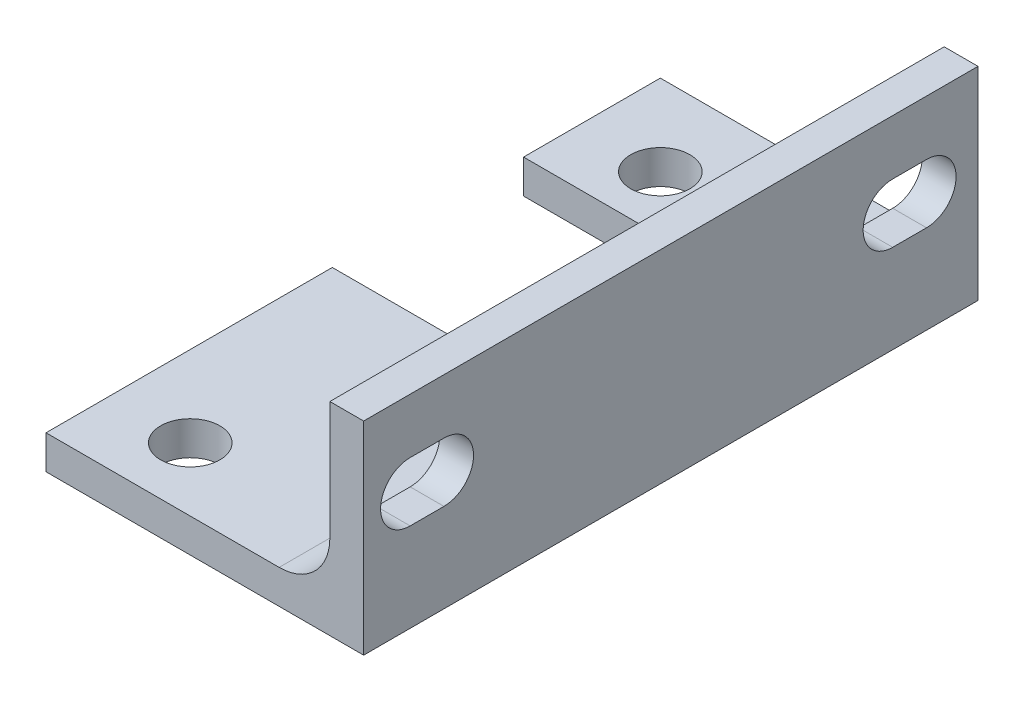
ISO-10303-21;
HEADER;
FILE_DESCRIPTION(('STEP AP214'),'2;1');
FILE_NAME('part.step','',(''),(''),'','','');
FILE_SCHEMA(('AUTOMOTIVE_DESIGN { 1 0 10303 214 1 1 1 1 }'));
ENDSEC;
DATA;
#1=APPLICATION_CONTEXT('core data for automotive mechanical design processes');
#2=APPLICATION_PROTOCOL_DEFINITION('international standard','automotive_design',2000,#1);
#3=PRODUCT_CONTEXT('',#1,'mechanical');
#4=PRODUCT('Part','Part','',(#3));
#5=PRODUCT_RELATED_PRODUCT_CATEGORY('part','',(#4));
#6=PRODUCT_DEFINITION_FORMATION('','',#4);
#7=PRODUCT_DEFINITION_CONTEXT('part definition',#1,'design');
#8=PRODUCT_DEFINITION('design','',#6,#7);
#9=PRODUCT_DEFINITION_SHAPE('','',#8);
#10=(LENGTH_UNIT() NAMED_UNIT(*) SI_UNIT(.MILLI.,.METRE.));
#11=(NAMED_UNIT(*) PLANE_ANGLE_UNIT() SI_UNIT($,.RADIAN.));
#12=(NAMED_UNIT(*) SI_UNIT($,.STERADIAN.) SOLID_ANGLE_UNIT());
#13=UNCERTAINTY_MEASURE_WITH_UNIT(LENGTH_MEASURE(1.E-05),#10,'distance_accuracy_value','');
#14=(GEOMETRIC_REPRESENTATION_CONTEXT(3) GLOBAL_UNCERTAINTY_ASSIGNED_CONTEXT((#13)) GLOBAL_UNIT_ASSIGNED_CONTEXT((#10,
#11,#12)) REPRESENTATION_CONTEXT('',''));
#15=CARTESIAN_POINT('',(0.,0.,0.));
#16=DIRECTION('',(0.,0.,1.));
#17=DIRECTION('',(1.,0.,0.));
#18=AXIS2_PLACEMENT_3D('',#15,#16,#17);
#19=CARTESIAN_POINT('',(0.,2.,0.));
#20=DIRECTION('',(0.,1.,0.));
#21=DIRECTION('',(0.,0.,1.));
#22=AXIS2_PLACEMENT_3D('',#19,#20,#21);
#23=PLANE('',#22);
#24=DIRECTION('',(1.,0.,0.));
#25=VECTOR('',#24,1.);
#26=CARTESIAN_POINT('',(5.60300623426312,2.,-2.5192554370748));
#27=LINE('',#26,#25);
#28=CARTESIAN_POINT('',(-1.92927117390983,2.,-2.5192554370748));
#29=VERTEX_POINT('',#28);
#30=CARTESIAN_POINT('',(11.8665295460925,2.,-2.5192554370748));
#31=VERTEX_POINT('',#30);
#32=EDGE_CURVE('E279',#29,#31,#27,.T.);
#33=ORIENTED_EDGE('',*,*,#32,.T.);
#34=DIRECTION('',(0.,0.,1.));
#35=VECTOR('',#34,1.);
#36=CARTESIAN_POINT('',(11.8665295460925,2.,0.));
#37=LINE('',#36,#35);
#38=CARTESIAN_POINT('',(11.8665295460925,2.,-38.869849506745));
#39=VERTEX_POINT('',#38);
#40=EDGE_CURVE('E53',#31,#39,#37,.F.);
#41=ORIENTED_EDGE('',*,*,#40,.T.);
#42=DIRECTION('',(-1.,0.,0.));
#43=VECTOR('',#42,1.);
#44=CARTESIAN_POINT('',(4.37040298014703,2.,-38.869849506745));
#45=LINE('',#44,#43);
#46=CARTESIAN_POINT('',(-1.92927117390983,2.,-38.869849506745));
#47=VERTEX_POINT('',#46);
#48=EDGE_CURVE('E266',#39,#47,#45,.T.);
#49=ORIENTED_EDGE('',*,*,#48,.T.);
#50=DIRECTION('',(0.,0.,1.));
#51=VECTOR('',#50,1.);
#52=CARTESIAN_POINT('',(-1.92927117390983,2.,-38.869849506745));
#53=LINE('',#52,#51);
#54=CARTESIAN_POINT('',(-1.92927117390983,2.,-30.7757565881923));
#55=VERTEX_POINT('',#54);
#56=EDGE_CURVE('E268',#47,#55,#53,.T.);
#57=ORIENTED_EDGE('',*,*,#56,.T.);
#58=DIRECTION('',(1.,0.,0.));
#59=VECTOR('',#58,1.);
#60=CARTESIAN_POINT('',(-1.92927117390983,2.,-30.7757565881923));
#61=LINE('',#60,#59);
#62=CARTESIAN_POINT('',(6.86652954609252,2.,-30.7757565881923));
#63=VERTEX_POINT('',#62);
#64=EDGE_CURVE('E271',#55,#63,#61,.T.);
#65=ORIENTED_EDGE('',*,*,#64,.T.);
#66=DIRECTION('',(0.,0.,1.));
#67=VECTOR('',#66,1.);
#68=CARTESIAN_POINT('',(6.86652954609252,2.,-30.7757565881923));
#69=LINE('',#68,#67);
#70=CARTESIAN_POINT('',(6.86652954609252,2.,-19.4605566961608));
#71=VERTEX_POINT('',#70);
#72=EDGE_CURVE('E273',#63,#71,#69,.T.);
#73=ORIENTED_EDGE('',*,*,#72,.T.);
#74=DIRECTION('',(-1.,0.,0.));
#75=VECTOR('',#74,1.);
#76=CARTESIAN_POINT('',(-1.92927117390983,2.,-19.4605566961608));
#77=LINE('',#76,#75);
#78=CARTESIAN_POINT('',(-1.92927117390983,2.,-19.4605566961608));
#79=VERTEX_POINT('',#78);
#80=EDGE_CURVE('E275',#71,#79,#77,.T.);
#81=ORIENTED_EDGE('',*,*,#80,.T.);
#82=DIRECTION('',(0.,0.,1.));
#83=VECTOR('',#82,1.);
#84=CARTESIAN_POINT('',(-1.92927117390983,2.,-2.5192554370748));
#85=LINE('',#84,#83);
#86=EDGE_CURVE('E277',#79,#29,#85,.T.);
#87=ORIENTED_EDGE('',*,*,#86,.T.);
#88=EDGE_LOOP('',(#33,#41,#49,#57,#65,#73,#81,#87));
#89=FACE_BOUND('',#88,.T.);
#90=CARTESIAN_POINT('',(2.86810593891513,2.,-34.0705679355194));
#91=DIRECTION('',(0.,1.,0.));
#92=DIRECTION('',(0.,0.,1.));
#93=AXIS2_PLACEMENT_3D('',#90,#91,#92);
#94=CIRCLE('',#93,1.75);
#95=CARTESIAN_POINT('',(2.86810593891513,2.,-32.3205679355194));
#96=VERTEX_POINT('',#95);
#97=EDGE_CURVE('E260',#96,#96,#94,.T.);
#98=ORIENTED_EDGE('',*,*,#97,.F.);
#99=EDGE_LOOP('',(#98));
#100=FACE_BOUND('',#99,.T.);
#101=CARTESIAN_POINT('',(2.85480124686773,2.,-6.27057111923954));
#102=DIRECTION('',(0.,1.,0.));
#103=DIRECTION('',(0.,0.,1.));
#104=AXIS2_PLACEMENT_3D('',#101,#102,#103);
#105=CIRCLE('',#104,1.75);
#106=CARTESIAN_POINT('',(2.85480124686773,2.,-4.52057111923954));
#107=VERTEX_POINT('',#106);
#108=EDGE_CURVE('E254',#107,#107,#105,.T.);
#109=ORIENTED_EDGE('',*,*,#108,.F.);
#110=EDGE_LOOP('',(#109));
#111=FACE_BOUND('',#110,.T.);
#112=ADVANCED_FACE('F32',(#89,#100,#111),#23,.T.);
#113=CARTESIAN_POINT('',(0.,0.,0.));
#114=DIRECTION('',(0.,1.,0.));
#115=DIRECTION('',(0.,0.,1.));
#116=AXIS2_PLACEMENT_3D('',#113,#114,#115);
#117=PLANE('',#116);
#118=DIRECTION('',(0.,0.,1.));
#119=VECTOR('',#118,1.);
#120=CARTESIAN_POINT('',(-1.92927117390983,0.,-38.869849506745));
#121=LINE('',#120,#119);
#122=CARTESIAN_POINT('',(-1.92927117390983,0.,-38.869849506745));
#123=VERTEX_POINT('',#122);
#124=CARTESIAN_POINT('',(-1.92927117390983,0.,-30.7757565881923));
#125=VERTEX_POINT('',#124);
#126=EDGE_CURVE('E263',#123,#125,#121,.T.);
#127=ORIENTED_EDGE('',*,*,#126,.F.);
#128=DIRECTION('',(-1.,0.,0.));
#129=VECTOR('',#128,1.);
#130=CARTESIAN_POINT('',(4.37040298014703,0.,-38.869849506745));
#131=LINE('',#130,#129);
#132=CARTESIAN_POINT('',(16.8665295460925,0.,-38.869849506745));
#133=VERTEX_POINT('',#132);
#134=EDGE_CURVE('E269',#133,#123,#131,.T.);
#135=ORIENTED_EDGE('',*,*,#134,.F.);
#136=DIRECTION('',(0.,0.,-1.));
#137=VECTOR('',#136,1.);
#138=CARTESIAN_POINT('',(16.8665295460925,0.,-38.869849506745));
#139=LINE('',#138,#137);
#140=CARTESIAN_POINT('',(16.8665295460925,0.,-2.5192554370748));
#141=VERTEX_POINT('',#140);
#142=EDGE_CURVE('E294',#141,#133,#139,.T.);
#143=ORIENTED_EDGE('',*,*,#142,.F.);
#144=DIRECTION('',(1.,0.,0.));
#145=VECTOR('',#144,1.);
#146=CARTESIAN_POINT('',(5.60300623426312,0.,-2.5192554370748));
#147=LINE('',#146,#145);
#148=CARTESIAN_POINT('',(-1.92927117390983,0.,-2.5192554370748));
#149=VERTEX_POINT('',#148);
#150=EDGE_CURVE('E292',#149,#141,#147,.T.);
#151=ORIENTED_EDGE('',*,*,#150,.F.);
#152=DIRECTION('',(0.,0.,1.));
#153=VECTOR('',#152,1.);
#154=CARTESIAN_POINT('',(-1.92927117390983,0.,-2.5192554370748));
#155=LINE('',#154,#153);
#156=CARTESIAN_POINT('',(-1.92927117390983,0.,-19.4605566961608));
#157=VERTEX_POINT('',#156);
#158=EDGE_CURVE('E289',#157,#149,#155,.T.);
#159=ORIENTED_EDGE('',*,*,#158,.F.);
#160=DIRECTION('',(-1.,0.,0.));
#161=VECTOR('',#160,1.);
#162=CARTESIAN_POINT('',(-1.92927117390983,0.,-19.4605566961608));
#163=LINE('',#162,#161);
#164=CARTESIAN_POINT('',(6.86652954609252,0.,-19.4605566961608));
#165=VERTEX_POINT('',#164);
#166=EDGE_CURVE('E287',#165,#157,#163,.T.);
#167=ORIENTED_EDGE('',*,*,#166,.F.);
#168=DIRECTION('',(0.,0.,1.));
#169=VECTOR('',#168,1.);
#170=CARTESIAN_POINT('',(6.86652954609252,0.,-30.7757565881923));
#171=LINE('',#170,#169);
#172=CARTESIAN_POINT('',(6.86652954609252,0.,-30.7757565881923));
#173=VERTEX_POINT('',#172);
#174=EDGE_CURVE('E285',#173,#165,#171,.T.);
#175=ORIENTED_EDGE('',*,*,#174,.F.);
#176=DIRECTION('',(1.,0.,0.));
#177=VECTOR('',#176,1.);
#178=CARTESIAN_POINT('',(-1.92927117390983,0.,-30.7757565881923));
#179=LINE('',#178,#177);
#180=EDGE_CURVE('E283',#125,#173,#179,.T.);
#181=ORIENTED_EDGE('',*,*,#180,.F.);
#182=EDGE_LOOP('',(#127,#135,#143,#151,#159,#167,#175,#181));
#183=FACE_BOUND('',#182,.T.);
#184=CARTESIAN_POINT('',(2.86810593891513,0.,-34.0705679355194));
#185=DIRECTION('',(0.,1.,0.));
#186=DIRECTION('',(0.,0.,1.));
#187=AXIS2_PLACEMENT_3D('',#184,#185,#186);
#188=CIRCLE('',#187,1.75);
#189=CARTESIAN_POINT('',(2.86810593891513,0.,-32.3205679355194));
#190=VERTEX_POINT('',#189);
#191=EDGE_CURVE('E257',#190,#190,#188,.T.);
#192=ORIENTED_EDGE('',*,*,#191,.T.);
#193=EDGE_LOOP('',(#192));
#194=FACE_BOUND('',#193,.T.);
#195=CARTESIAN_POINT('',(2.85480124686773,0.,-6.27057111923954));
#196=DIRECTION('',(0.,1.,0.));
#197=DIRECTION('',(0.,0.,1.));
#198=AXIS2_PLACEMENT_3D('',#195,#196,#197);
#199=CIRCLE('',#198,1.75);
#200=CARTESIAN_POINT('',(2.85480124686773,0.,-4.52057111923954));
#201=VERTEX_POINT('',#200);
#202=EDGE_CURVE('E253',#201,#201,#199,.T.);
#203=ORIENTED_EDGE('',*,*,#202,.T.);
#204=EDGE_LOOP('',(#203));
#205=FACE_BOUND('',#204,.T.);
#206=ADVANCED_FACE('F349',(#183,#194,#205),#117,.F.);
#207=CARTESIAN_POINT('',(-1.92927117390983,2.,-38.869849506745));
#208=DIRECTION('',(1.,0.,0.));
#209=DIRECTION('',(0.,0.,-1.));
#210=AXIS2_PLACEMENT_3D('',#207,#208,#209);
#211=PLANE('',#210);
#212=ORIENTED_EDGE('',*,*,#126,.T.);
#213=DIRECTION('',(0.,-1.,0.));
#214=VECTOR('',#213,1.);
#215=CARTESIAN_POINT('',(-1.92927117390983,2.,-30.7757565881923));
#216=LINE('',#215,#214);
#217=EDGE_CURVE('E314',#55,#125,#216,.T.);
#218=ORIENTED_EDGE('',*,*,#217,.F.);
#219=ORIENTED_EDGE('',*,*,#56,.F.);
#220=DIRECTION('',(0.,-1.,0.));
#221=VECTOR('',#220,1.);
#222=CARTESIAN_POINT('',(-1.92927117390983,2.,-38.869849506745));
#223=LINE('',#222,#221);
#224=EDGE_CURVE('E317',#47,#123,#223,.T.);
#225=ORIENTED_EDGE('',*,*,#224,.T.);
#226=EDGE_LOOP('',(#212,#218,#219,#225));
#227=FACE_BOUND('',#226,.T.);
#228=ADVANCED_FACE('F354',(#227),#211,.F.);
#229=CARTESIAN_POINT('',(-1.92927117390983,2.,-30.7757565881923));
#230=DIRECTION('',(0.,0.,-1.));
#231=DIRECTION('',(-1.,0.,0.));
#232=AXIS2_PLACEMENT_3D('',#229,#230,#231);
#233=PLANE('',#232);
#234=ORIENTED_EDGE('',*,*,#180,.T.);
#235=DIRECTION('',(0.,-1.,0.));
#236=VECTOR('',#235,1.);
#237=CARTESIAN_POINT('',(6.86652954609252,2.,-30.7757565881923));
#238=LINE('',#237,#236);
#239=EDGE_CURVE('E311',#63,#173,#238,.T.);
#240=ORIENTED_EDGE('',*,*,#239,.F.);
#241=ORIENTED_EDGE('',*,*,#64,.F.);
#242=ORIENTED_EDGE('',*,*,#217,.T.);
#243=EDGE_LOOP('',(#234,#240,#241,#242));
#244=FACE_BOUND('',#243,.T.);
#245=ADVANCED_FACE('F380',(#244),#233,.F.);
#246=CARTESIAN_POINT('',(6.86652954609252,2.,-30.7757565881923));
#247=DIRECTION('',(1.,0.,0.));
#248=DIRECTION('',(0.,0.,-1.));
#249=AXIS2_PLACEMENT_3D('',#246,#247,#248);
#250=PLANE('',#249);
#251=ORIENTED_EDGE('',*,*,#174,.T.);
#252=DIRECTION('',(0.,-1.,0.));
#253=VECTOR('',#252,1.);
#254=CARTESIAN_POINT('',(6.86652954609252,2.,-19.4605566961608));
#255=LINE('',#254,#253);
#256=EDGE_CURVE('E308',#71,#165,#255,.T.);
#257=ORIENTED_EDGE('',*,*,#256,.F.);
#258=ORIENTED_EDGE('',*,*,#72,.F.);
#259=ORIENTED_EDGE('',*,*,#239,.T.);
#260=EDGE_LOOP('',(#251,#257,#258,#259));
#261=FACE_BOUND('',#260,.T.);
#262=ADVANCED_FACE('F376',(#261),#250,.F.);
#263=CARTESIAN_POINT('',(-1.92927117390983,2.,-19.4605566961608));
#264=DIRECTION('',(0.,0.,1.));
#265=DIRECTION('',(1.,0.,0.));
#266=AXIS2_PLACEMENT_3D('',#263,#264,#265);
#267=PLANE('',#266);
#268=ORIENTED_EDGE('',*,*,#166,.T.);
#269=DIRECTION('',(0.,-1.,0.));
#270=VECTOR('',#269,1.);
#271=CARTESIAN_POINT('',(-1.92927117390983,2.,-19.4605566961608));
#272=LINE('',#271,#270);
#273=EDGE_CURVE('E305',#79,#157,#272,.T.);
#274=ORIENTED_EDGE('',*,*,#273,.F.);
#275=ORIENTED_EDGE('',*,*,#80,.F.);
#276=ORIENTED_EDGE('',*,*,#256,.T.);
#277=EDGE_LOOP('',(#268,#274,#275,#276));
#278=FACE_BOUND('',#277,.T.);
#279=ADVANCED_FACE('F372',(#278),#267,.F.);
#280=CARTESIAN_POINT('',(-1.92927117390983,2.,-2.5192554370748));
#281=DIRECTION('',(1.,0.,0.));
#282=DIRECTION('',(0.,0.,-1.));
#283=AXIS2_PLACEMENT_3D('',#280,#281,#282);
#284=PLANE('',#283);
#285=ORIENTED_EDGE('',*,*,#158,.T.);
#286=DIRECTION('',(0.,-1.,0.));
#287=VECTOR('',#286,1.);
#288=CARTESIAN_POINT('',(-1.92927117390983,2.,-2.5192554370748));
#289=LINE('',#288,#287);
#290=EDGE_CURVE('E302',#29,#149,#289,.T.);
#291=ORIENTED_EDGE('',*,*,#290,.F.);
#292=ORIENTED_EDGE('',*,*,#86,.F.);
#293=ORIENTED_EDGE('',*,*,#273,.T.);
#294=EDGE_LOOP('',(#285,#291,#292,#293));
#295=FACE_BOUND('',#294,.T.);
#296=ADVANCED_FACE('F369',(#295),#284,.F.);
#297=CARTESIAN_POINT('',(5.60300623426312,2.,-2.5192554370748));
#298=DIRECTION('',(0.,0.,-1.));
#299=DIRECTION('',(-1.,0.,0.));
#300=AXIS2_PLACEMENT_3D('',#297,#298,#299);
#301=PLANE('',#300);
#302=ORIENTED_EDGE('',*,*,#150,.T.);
#303=DIRECTION('',(0.,-1.,0.));
#304=VECTOR('',#303,1.);
#305=CARTESIAN_POINT('',(16.8665295460925,2.,-2.5192554370748));
#306=LINE('',#305,#304);
#307=CARTESIAN_POINT('',(16.8665295460925,12.,-2.5192554370748));
#308=VERTEX_POINT('',#307);
#309=EDGE_CURVE('E299',#308,#141,#306,.T.);
#310=ORIENTED_EDGE('',*,*,#309,.F.);
#311=DIRECTION('',(1.,0.,0.));
#312=VECTOR('',#311,1.);
#313=CARTESIAN_POINT('',(16.8665295460925,12.,-2.5192554370748));
#314=LINE('',#313,#312);
#315=CARTESIAN_POINT('',(14.8665295460925,12.,-2.5192554370748));
#316=VERTEX_POINT('',#315);
#317=EDGE_CURVE('E245',#316,#308,#314,.T.);
#318=ORIENTED_EDGE('',*,*,#317,.F.);
#319=DIRECTION('',(0.,-1.,0.));
#320=VECTOR('',#319,1.);
#321=CARTESIAN_POINT('',(14.8665295460925,12.,-2.5192554370748));
#322=LINE('',#321,#320);
#323=CARTESIAN_POINT('',(14.8665295460925,5.,-2.5192554370748));
#324=VERTEX_POINT('',#323);
#325=EDGE_CURVE('E248',#316,#324,#322,.T.);
#326=ORIENTED_EDGE('',*,*,#325,.T.);
#327=CARTESIAN_POINT('',(11.8665295460925,5.,-2.5192554370748));
#328=DIRECTION('',(0.,0.,-1.));
#329=DIRECTION('',(-1.,0.,0.));
#330=AXIS2_PLACEMENT_3D('',#327,#328,#329);
#331=CIRCLE('',#330,3.);
#332=EDGE_CURVE('E40',#324,#31,#331,.T.);
#333=ORIENTED_EDGE('',*,*,#332,.T.);
#334=ORIENTED_EDGE('',*,*,#32,.F.);
#335=ORIENTED_EDGE('',*,*,#290,.T.);
#336=EDGE_LOOP('',(#302,#310,#318,#326,#333,#334,#335));
#337=FACE_BOUND('',#336,.T.);
#338=ADVANCED_FACE('F331',(#337),#301,.F.);
#339=CARTESIAN_POINT('',(16.8665295460925,2.,-38.869849506745));
#340=DIRECTION('',(-1.,0.,0.));
#341=DIRECTION('',(0.,0.,1.));
#342=AXIS2_PLACEMENT_3D('',#339,#340,#341);
#343=PLANE('',#342);
#344=DIRECTION('',(0.,0.,1.));
#345=VECTOR('',#344,1.);
#346=CARTESIAN_POINT('',(16.8665295460925,5.24999999999999,-38.869849506745));
#347=LINE('',#346,#345);
#348=CARTESIAN_POINT('',(16.8665295460925,5.25,-7.27057111923954));
#349=VERTEX_POINT('',#348);
#350=CARTESIAN_POINT('',(16.8665295460925,5.25,-5.27057111923954));
#351=VERTEX_POINT('',#350);
#352=EDGE_CURVE('E232',#349,#351,#347,.T.);
#353=ORIENTED_EDGE('',*,*,#352,.T.);
#354=CARTESIAN_POINT('',(16.8665295460925,7.00000000000001,-5.27057111923954));
#355=DIRECTION('',(-1.,0.,0.));
#356=DIRECTION('',(0.,0.,1.));
#357=AXIS2_PLACEMENT_3D('',#354,#355,#356);
#358=CIRCLE('',#357,1.75);
#359=CARTESIAN_POINT('',(16.8665295460925,8.75,-5.27057111923954));
#360=VERTEX_POINT('',#359);
#361=EDGE_CURVE('E235',#351,#360,#358,.T.);
#362=ORIENTED_EDGE('',*,*,#361,.T.);
#363=DIRECTION('',(0.,0.,-1.));
#364=VECTOR('',#363,1.);
#365=CARTESIAN_POINT('',(16.8665295460925,8.75,-38.869849506745));
#366=LINE('',#365,#364);
#367=CARTESIAN_POINT('',(16.8665295460925,8.75,-7.27057111923953));
#368=VERTEX_POINT('',#367);
#369=EDGE_CURVE('E229',#360,#368,#366,.T.);
#370=ORIENTED_EDGE('',*,*,#369,.T.);
#371=CARTESIAN_POINT('',(16.8665295460925,7.,-7.27057111923954));
#372=DIRECTION('',(-1.,0.,0.));
#373=DIRECTION('',(0.,0.,1.));
#374=AXIS2_PLACEMENT_3D('',#371,#372,#373);
#375=CIRCLE('',#374,1.75);
#376=EDGE_CURVE('E170',#368,#349,#375,.T.);
#377=ORIENTED_EDGE('',*,*,#376,.T.);
#378=EDGE_LOOP('',(#353,#362,#370,#377));
#379=FACE_BOUND('',#378,.T.);
#380=DIRECTION('',(0.,0.,1.));
#381=VECTOR('',#380,1.);
#382=CARTESIAN_POINT('',(16.8665295460925,5.25,-38.869849506745));
#383=LINE('',#382,#381);
#384=CARTESIAN_POINT('',(16.8665295460925,5.25,-35.8228030474687));
#385=VERTEX_POINT('',#384);
#386=CARTESIAN_POINT('',(16.8665295460925,5.25,-33.8228030474687));
#387=VERTEX_POINT('',#386);
#388=EDGE_CURVE('E223',#385,#387,#383,.T.);
#389=ORIENTED_EDGE('',*,*,#388,.T.);
#390=CARTESIAN_POINT('',(16.8665295460925,7.,-33.8228030474687));
#391=DIRECTION('',(-1.,0.,0.));
#392=DIRECTION('',(0.,0.,1.));
#393=AXIS2_PLACEMENT_3D('',#390,#391,#392);
#394=CIRCLE('',#393,1.75);
#395=CARTESIAN_POINT('',(16.8665295460925,8.75,-33.8228030474687));
#396=VERTEX_POINT('',#395);
#397=EDGE_CURVE('E226',#387,#396,#394,.T.);
#398=ORIENTED_EDGE('',*,*,#397,.T.);
#399=DIRECTION('',(0.,0.,-1.));
#400=VECTOR('',#399,1.);
#401=CARTESIAN_POINT('',(16.8665295460925,8.75,-38.869849506745));
#402=LINE('',#401,#400);
#403=CARTESIAN_POINT('',(16.8665295460925,8.75,-35.8228030474687));
#404=VERTEX_POINT('',#403);
#405=EDGE_CURVE('E195',#396,#404,#402,.T.);
#406=ORIENTED_EDGE('',*,*,#405,.T.);
#407=CARTESIAN_POINT('',(16.8665295460925,7.,-35.8228030474687));
#408=DIRECTION('',(-1.,0.,0.));
#409=DIRECTION('',(0.,0.,1.));
#410=AXIS2_PLACEMENT_3D('',#407,#408,#409);
#411=CIRCLE('',#410,1.75);
#412=EDGE_CURVE('E220',#404,#385,#411,.T.);
#413=ORIENTED_EDGE('',*,*,#412,.T.);
#414=EDGE_LOOP('',(#389,#398,#406,#413));
#415=FACE_BOUND('',#414,.T.);
#416=ORIENTED_EDGE('',*,*,#142,.T.);
#417=DIRECTION('',(0.,-1.,0.));
#418=VECTOR('',#417,1.);
#419=CARTESIAN_POINT('',(16.8665295460925,2.,-38.869849506745));
#420=LINE('',#419,#418);
#421=CARTESIAN_POINT('',(16.8665295460925,12.,-38.869849506745));
#422=VERTEX_POINT('',#421);
#423=EDGE_CURVE('E281',#422,#133,#420,.T.);
#424=ORIENTED_EDGE('',*,*,#423,.F.);
#425=DIRECTION('',(0.,0.,-1.));
#426=VECTOR('',#425,1.);
#427=CARTESIAN_POINT('',(16.8665295460925,12.,-38.869849506745));
#428=LINE('',#427,#426);
#429=EDGE_CURVE('E238',#308,#422,#428,.T.);
#430=ORIENTED_EDGE('',*,*,#429,.F.);
#431=ORIENTED_EDGE('',*,*,#309,.T.);
#432=EDGE_LOOP('',(#416,#424,#430,#431));
#433=FACE_BOUND('',#432,.T.);
#434=ADVANCED_FACE('F336',(#379,#415,#433),#343,.F.);
#435=CARTESIAN_POINT('',(4.37040298014703,2.,-38.869849506745));
#436=DIRECTION('',(0.,0.,1.));
#437=DIRECTION('',(1.,0.,0.));
#438=AXIS2_PLACEMENT_3D('',#435,#436,#437);
#439=PLANE('',#438);
#440=ORIENTED_EDGE('',*,*,#134,.T.);
#441=ORIENTED_EDGE('',*,*,#224,.F.);
#442=ORIENTED_EDGE('',*,*,#48,.F.);
#443=CARTESIAN_POINT('',(11.8665295460925,5.,-38.869849506745));
#444=DIRECTION('',(0.,0.,1.));
#445=DIRECTION('',(1.,0.,0.));
#446=AXIS2_PLACEMENT_3D('',#443,#444,#445);
#447=CIRCLE('',#446,3.);
#448=CARTESIAN_POINT('',(14.8665295460925,5.,-38.869849506745));
#449=VERTEX_POINT('',#448);
#450=EDGE_CURVE('E11',#39,#449,#447,.T.);
#451=ORIENTED_EDGE('',*,*,#450,.T.);
#452=DIRECTION('',(0.,-1.,0.));
#453=VECTOR('',#452,1.);
#454=CARTESIAN_POINT('',(14.8665295460925,12.,-38.869849506745));
#455=LINE('',#454,#453);
#456=CARTESIAN_POINT('',(14.8665295460925,12.,-38.869849506745));
#457=VERTEX_POINT('',#456);
#458=EDGE_CURVE('E250',#457,#449,#455,.T.);
#459=ORIENTED_EDGE('',*,*,#458,.F.);
#460=DIRECTION('',(-1.,0.,0.));
#461=VECTOR('',#460,1.);
#462=CARTESIAN_POINT('',(16.8665295460925,12.,-38.869849506745));
#463=LINE('',#462,#461);
#464=EDGE_CURVE('E241',#422,#457,#463,.T.);
#465=ORIENTED_EDGE('',*,*,#464,.F.);
#466=ORIENTED_EDGE('',*,*,#423,.T.);
#467=EDGE_LOOP('',(#440,#441,#442,#451,#459,#465,#466));
#468=FACE_BOUND('',#467,.T.);
#469=ADVANCED_FACE('F341',(#468),#439,.F.);
#470=CARTESIAN_POINT('',(2.86810593891513,2.,-34.0705679355194));
#471=DIRECTION('',(0.,-1.,0.));
#472=DIRECTION('',(0.,0.,-1.));
#473=AXIS2_PLACEMENT_3D('',#470,#471,#472);
#474=CYLINDRICAL_SURFACE('',#473,1.75);
#475=ORIENTED_EDGE('',*,*,#97,.T.);
#476=EDGE_LOOP('',(#475));
#477=FACE_BOUND('',#476,.T.);
#478=ORIENTED_EDGE('',*,*,#191,.F.);
#479=EDGE_LOOP('',(#478));
#480=FACE_BOUND('',#479,.T.);
#481=ADVANCED_FACE('F359',(#477,#480),#474,.F.);
#482=CARTESIAN_POINT('',(2.85480124686773,2.,-6.27057111923954));
#483=DIRECTION('',(0.,-1.,0.));
#484=DIRECTION('',(0.,0.,-1.));
#485=AXIS2_PLACEMENT_3D('',#482,#483,#484);
#486=CYLINDRICAL_SURFACE('',#485,1.75);
#487=ORIENTED_EDGE('',*,*,#108,.T.);
#488=EDGE_LOOP('',(#487));
#489=FACE_BOUND('',#488,.T.);
#490=ORIENTED_EDGE('',*,*,#202,.F.);
#491=EDGE_LOOP('',(#490));
#492=FACE_BOUND('',#491,.T.);
#493=ADVANCED_FACE('F408',(#489,#492),#486,.F.);
#494=CARTESIAN_POINT('',(14.8665295460925,12.,-38.869849506745));
#495=DIRECTION('',(1.,0.,0.));
#496=DIRECTION('',(0.,0.,-1.));
#497=AXIS2_PLACEMENT_3D('',#494,#495,#496);
#498=PLANE('',#497);
#499=DIRECTION('',(0.,0.,-1.));
#500=VECTOR('',#499,1.);
#501=CARTESIAN_POINT('',(14.8665295460925,8.75,-5.27057111923954));
#502=LINE('',#501,#500);
#503=CARTESIAN_POINT('',(14.8665295460925,8.75,-5.27057111923954));
#504=VERTEX_POINT('',#503);
#505=CARTESIAN_POINT('',(14.8665295460925,8.75,-7.27057111923954));
#506=VERTEX_POINT('',#505);
#507=EDGE_CURVE('E178',#504,#506,#502,.T.);
#508=ORIENTED_EDGE('',*,*,#507,.F.);
#509=CARTESIAN_POINT('',(14.8665295460925,7.00000000000001,-5.27057111923954));
#510=DIRECTION('',(-1.,0.,0.));
#511=DIRECTION('',(0.,0.,1.));
#512=AXIS2_PLACEMENT_3D('',#509,#510,#511);
#513=CIRCLE('',#512,1.75);
#514=CARTESIAN_POINT('',(14.8665295460925,5.25,-5.27057111923954));
#515=VERTEX_POINT('',#514);
#516=EDGE_CURVE('E183',#515,#504,#513,.T.);
#517=ORIENTED_EDGE('',*,*,#516,.F.);
#518=DIRECTION('',(0.,0.,1.));
#519=VECTOR('',#518,1.);
#520=CARTESIAN_POINT('',(14.8665295460925,5.25,-5.27057111923954));
#521=LINE('',#520,#519);
#522=CARTESIAN_POINT('',(14.8665295460925,5.25,-7.27057111923954));
#523=VERTEX_POINT('',#522);
#524=EDGE_CURVE('E188',#523,#515,#521,.T.);
#525=ORIENTED_EDGE('',*,*,#524,.F.);
#526=CARTESIAN_POINT('',(14.8665295460925,7.,-7.27057111923954));
#527=DIRECTION('',(-1.,0.,0.));
#528=DIRECTION('',(0.,0.,1.));
#529=AXIS2_PLACEMENT_3D('',#526,#527,#528);
#530=CIRCLE('',#529,1.75);
#531=EDGE_CURVE('E167',#506,#523,#530,.T.);
#532=ORIENTED_EDGE('',*,*,#531,.F.);
#533=EDGE_LOOP('',(#508,#517,#525,#532));
#534=FACE_BOUND('',#533,.T.);
#535=DIRECTION('',(0.,0.,-1.));
#536=VECTOR('',#535,1.);
#537=CARTESIAN_POINT('',(14.8665295460925,8.75,-33.8228030474687));
#538=LINE('',#537,#536);
#539=CARTESIAN_POINT('',(14.8665295460925,8.75,-33.8228030474687));
#540=VERTEX_POINT('',#539);
#541=CARTESIAN_POINT('',(14.8665295460925,8.75,-35.8228030474687));
#542=VERTEX_POINT('',#541);
#543=EDGE_CURVE('E200',#540,#542,#538,.T.);
#544=ORIENTED_EDGE('',*,*,#543,.F.);
#545=CARTESIAN_POINT('',(14.8665295460925,7.,-33.8228030474687));
#546=DIRECTION('',(-1.,0.,0.));
#547=DIRECTION('',(0.,0.,1.));
#548=AXIS2_PLACEMENT_3D('',#545,#546,#547);
#549=CIRCLE('',#548,1.75);
#550=CARTESIAN_POINT('',(14.8665295460925,5.25,-33.8228030474687));
#551=VERTEX_POINT('',#550);
#552=EDGE_CURVE('E198',#551,#540,#549,.T.);
#553=ORIENTED_EDGE('',*,*,#552,.F.);
#554=DIRECTION('',(0.,0.,1.));
#555=VECTOR('',#554,1.);
#556=CARTESIAN_POINT('',(14.8665295460925,5.25,-33.8228030474687));
#557=LINE('',#556,#555);
#558=CARTESIAN_POINT('',(14.8665295460925,5.25,-35.8228030474687));
#559=VERTEX_POINT('',#558);
#560=EDGE_CURVE('E206',#559,#551,#557,.T.);
#561=ORIENTED_EDGE('',*,*,#560,.F.);
#562=CARTESIAN_POINT('',(14.8665295460925,7.,-35.8228030474687));
#563=DIRECTION('',(-1.,0.,0.));
#564=DIRECTION('',(0.,0.,1.));
#565=AXIS2_PLACEMENT_3D('',#562,#563,#564);
#566=CIRCLE('',#565,1.75);
#567=EDGE_CURVE('E203',#542,#559,#566,.T.);
#568=ORIENTED_EDGE('',*,*,#567,.F.);
#569=EDGE_LOOP('',(#544,#553,#561,#568));
#570=FACE_BOUND('',#569,.T.);
#571=ORIENTED_EDGE('',*,*,#458,.T.);
#572=DIRECTION('',(0.,0.,1.));
#573=VECTOR('',#572,1.);
#574=CARTESIAN_POINT('',(14.8665295460925,5.,-38.869849506745));
#575=LINE('',#574,#573);
#576=EDGE_CURVE('E320',#449,#324,#575,.T.);
#577=ORIENTED_EDGE('',*,*,#576,.T.);
#578=ORIENTED_EDGE('',*,*,#325,.F.);
#579=DIRECTION('',(0.,0.,1.));
#580=VECTOR('',#579,1.);
#581=CARTESIAN_POINT('',(14.8665295460925,12.,-38.869849506745));
#582=LINE('',#581,#580);
#583=EDGE_CURVE('E243',#457,#316,#582,.T.);
#584=ORIENTED_EDGE('',*,*,#583,.F.);
#585=EDGE_LOOP('',(#571,#577,#578,#584));
#586=FACE_BOUND('',#585,.T.);
#587=ADVANCED_FACE('F185',(#534,#570,#586),#498,.F.);
#588=CARTESIAN_POINT('',(0.,12.,0.));
#589=DIRECTION('',(0.,-1.,0.));
#590=DIRECTION('',(0.,0.,-1.));
#591=AXIS2_PLACEMENT_3D('',#588,#589,#590);
#592=PLANE('',#591);
#593=ORIENTED_EDGE('',*,*,#429,.T.);
#594=ORIENTED_EDGE('',*,*,#464,.T.);
#595=ORIENTED_EDGE('',*,*,#583,.T.);
#596=ORIENTED_EDGE('',*,*,#317,.T.);
#597=EDGE_LOOP('',(#593,#594,#595,#596));
#598=FACE_BOUND('',#597,.T.);
#599=ADVANCED_FACE('F334',(#598),#592,.F.);
#600=CARTESIAN_POINT('',(24.8665295460925,7.,-33.8228030474687));
#601=DIRECTION('',(-1.,0.,0.));
#602=DIRECTION('',(0.,0.,1.));
#603=AXIS2_PLACEMENT_3D('',#600,#601,#602);
#604=CYLINDRICAL_SURFACE('',#603,1.75);
#605=DIRECTION('',(-1.,0.,0.));
#606=VECTOR('',#605,1.);
#607=CARTESIAN_POINT('',(24.8665295460925,5.25,-33.8228030474687));
#608=LINE('',#607,#606);
#609=EDGE_CURVE('E210',#387,#551,#608,.T.);
#610=ORIENTED_EDGE('',*,*,#609,.T.);
#611=ORIENTED_EDGE('',*,*,#552,.T.);
#612=DIRECTION('',(-1.,0.,0.));
#613=VECTOR('',#612,1.);
#614=CARTESIAN_POINT('',(24.8665295460925,8.75,-33.8228030474687));
#615=LINE('',#614,#613);
#616=EDGE_CURVE('E209',#396,#540,#615,.T.);
#617=ORIENTED_EDGE('',*,*,#616,.F.);
#618=ORIENTED_EDGE('',*,*,#397,.F.);
#619=EDGE_LOOP('',(#610,#611,#617,#618));
#620=FACE_BOUND('',#619,.T.);
#621=ADVANCED_FACE('F420',(#620),#604,.F.);
#622=CARTESIAN_POINT('',(24.8665295460925,5.25,-33.8228030474687));
#623=DIRECTION('',(0.,-1.,0.));
#624=DIRECTION('',(0.,0.,-1.));
#625=AXIS2_PLACEMENT_3D('',#622,#623,#624);
#626=PLANE('',#625);
#627=DIRECTION('',(-1.,0.,0.));
#628=VECTOR('',#627,1.);
#629=CARTESIAN_POINT('',(24.8665295460925,5.25,-35.8228030474687));
#630=LINE('',#629,#628);
#631=EDGE_CURVE('E212',#385,#559,#630,.T.);
#632=ORIENTED_EDGE('',*,*,#631,.T.);
#633=ORIENTED_EDGE('',*,*,#560,.T.);
#634=ORIENTED_EDGE('',*,*,#609,.F.);
#635=ORIENTED_EDGE('',*,*,#388,.F.);
#636=EDGE_LOOP('',(#632,#633,#634,#635));
#637=FACE_BOUND('',#636,.T.);
#638=ADVANCED_FACE('F423',(#637),#626,.F.);
#639=CARTESIAN_POINT('',(24.8665295460925,7.,-35.8228030474687));
#640=DIRECTION('',(-1.,0.,0.));
#641=DIRECTION('',(0.,0.,1.));
#642=AXIS2_PLACEMENT_3D('',#639,#640,#641);
#643=CYLINDRICAL_SURFACE('',#642,1.75);
#644=DIRECTION('',(-1.,0.,0.));
#645=VECTOR('',#644,1.);
#646=CARTESIAN_POINT('',(24.8665295460925,8.75,-35.8228030474687));
#647=LINE('',#646,#645);
#648=EDGE_CURVE('E214',#404,#542,#647,.T.);
#649=ORIENTED_EDGE('',*,*,#648,.T.);
#650=ORIENTED_EDGE('',*,*,#567,.T.);
#651=ORIENTED_EDGE('',*,*,#631,.F.);
#652=ORIENTED_EDGE('',*,*,#412,.F.);
#653=EDGE_LOOP('',(#649,#650,#651,#652));
#654=FACE_BOUND('',#653,.T.);
#655=ADVANCED_FACE('F429',(#654),#643,.F.);
#656=CARTESIAN_POINT('',(24.8665295460925,8.75,-33.8228030474687));
#657=DIRECTION('',(0.,1.,0.));
#658=DIRECTION('',(0.,0.,1.));
#659=AXIS2_PLACEMENT_3D('',#656,#657,#658);
#660=PLANE('',#659);
#661=ORIENTED_EDGE('',*,*,#616,.T.);
#662=ORIENTED_EDGE('',*,*,#543,.T.);
#663=ORIENTED_EDGE('',*,*,#648,.F.);
#664=ORIENTED_EDGE('',*,*,#405,.F.);
#665=EDGE_LOOP('',(#661,#662,#663,#664));
#666=FACE_BOUND('',#665,.T.);
#667=ADVANCED_FACE('F425',(#666),#660,.F.);
#668=CARTESIAN_POINT('',(24.8665295460925,7.00000000000001,-5.27057111923954));
#669=DIRECTION('',(-1.,0.,0.));
#670=DIRECTION('',(0.,0.,1.));
#671=AXIS2_PLACEMENT_3D('',#668,#669,#670);
#672=CYLINDRICAL_SURFACE('',#671,1.75);
#673=DIRECTION('',(-1.,0.,0.));
#674=VECTOR('',#673,1.);
#675=CARTESIAN_POINT('',(24.8665295460925,5.25,-5.27057111923954));
#676=LINE('',#675,#674);
#677=EDGE_CURVE('E193',#351,#515,#676,.T.);
#678=ORIENTED_EDGE('',*,*,#677,.T.);
#679=ORIENTED_EDGE('',*,*,#516,.T.);
#680=DIRECTION('',(-1.,0.,0.));
#681=VECTOR('',#680,1.);
#682=CARTESIAN_POINT('',(24.8665295460925,8.75,-5.27057111923954));
#683=LINE('',#682,#681);
#684=EDGE_CURVE('E174',#360,#504,#683,.T.);
#685=ORIENTED_EDGE('',*,*,#684,.F.);
#686=ORIENTED_EDGE('',*,*,#361,.F.);
#687=EDGE_LOOP('',(#678,#679,#685,#686));
#688=FACE_BOUND('',#687,.T.);
#689=ADVANCED_FACE('F428',(#688),#672,.F.);
#690=CARTESIAN_POINT('',(24.8665295460925,5.25,-5.27057111923954));
#691=DIRECTION('',(0.,-1.,0.));
#692=DIRECTION('',(0.,0.,-1.));
#693=AXIS2_PLACEMENT_3D('',#690,#691,#692);
#694=PLANE('',#693);
#695=DIRECTION('',(-1.,0.,0.));
#696=VECTOR('',#695,1.);
#697=CARTESIAN_POINT('',(24.8665295460925,5.25,-7.27057111923954));
#698=LINE('',#697,#696);
#699=EDGE_CURVE('E173',#349,#523,#698,.T.);
#700=ORIENTED_EDGE('',*,*,#699,.T.);
#701=ORIENTED_EDGE('',*,*,#524,.T.);
#702=ORIENTED_EDGE('',*,*,#677,.F.);
#703=ORIENTED_EDGE('',*,*,#352,.F.);
#704=EDGE_LOOP('',(#700,#701,#702,#703));
#705=FACE_BOUND('',#704,.T.);
#706=ADVANCED_FACE('F438',(#705),#694,.F.);
#707=CARTESIAN_POINT('',(24.8665295460925,7.,-7.27057111923954));
#708=DIRECTION('',(-1.,0.,0.));
#709=DIRECTION('',(0.,0.,1.));
#710=AXIS2_PLACEMENT_3D('',#707,#708,#709);
#711=CYLINDRICAL_SURFACE('',#710,1.75);
#712=DIRECTION('',(-1.,0.,0.));
#713=VECTOR('',#712,1.);
#714=CARTESIAN_POINT('',(24.8665295460925,8.75,-7.27057111923954));
#715=LINE('',#714,#713);
#716=EDGE_CURVE('E162',#368,#506,#715,.T.);
#717=ORIENTED_EDGE('',*,*,#716,.T.);
#718=ORIENTED_EDGE('',*,*,#531,.T.);
#719=ORIENTED_EDGE('',*,*,#699,.F.);
#720=ORIENTED_EDGE('',*,*,#376,.F.);
#721=EDGE_LOOP('',(#717,#718,#719,#720));
#722=FACE_BOUND('',#721,.T.);
#723=ADVANCED_FACE('F164',(#722),#711,.F.);
#724=CARTESIAN_POINT('',(24.8665295460925,8.75,-5.27057111923954));
#725=DIRECTION('',(0.,1.,0.));
#726=DIRECTION('',(0.,0.,1.));
#727=AXIS2_PLACEMENT_3D('',#724,#725,#726);
#728=PLANE('',#727);
#729=ORIENTED_EDGE('',*,*,#684,.T.);
#730=ORIENTED_EDGE('',*,*,#507,.T.);
#731=ORIENTED_EDGE('',*,*,#716,.F.);
#732=ORIENTED_EDGE('',*,*,#369,.F.);
#733=EDGE_LOOP('',(#729,#730,#731,#732));
#734=FACE_BOUND('',#733,.T.);
#735=ADVANCED_FACE('F179',(#734),#728,.F.);
#736=CARTESIAN_POINT('',(11.8665295460925,5.,-38.869849506745));
#737=DIRECTION('',(0.,0.,1.));
#738=DIRECTION('',(1.,0.,0.));
#739=AXIS2_PLACEMENT_3D('',#736,#737,#738);
#740=CYLINDRICAL_SURFACE('',#739,3.);
#741=ORIENTED_EDGE('',*,*,#450,.F.);
#742=ORIENTED_EDGE('',*,*,#40,.F.);
#743=ORIENTED_EDGE('',*,*,#332,.F.);
#744=ORIENTED_EDGE('',*,*,#576,.F.);
#745=EDGE_LOOP('',(#741,#742,#743,#744));
#746=FACE_BOUND('',#745,.T.);
#747=ADVANCED_FACE('F34',(#746),#740,.F.);
#748=CLOSED_SHELL('',(#112,#206,#228,#245,#262,#279,#296,#338,#434,#469,#481,#493,#587,#599,
#621,#638,#655,#667,#689,#706,#723,#735,#747));
#749=MANIFOLD_SOLID_BREP('B2',#748);
#750=ADVANCED_BREP_SHAPE_REPRESENTATION('',(#18,#749),#14);
#751=SHAPE_DEFINITION_REPRESENTATION(#9,#750);
ENDSEC;
END-ISO-10303-21;
